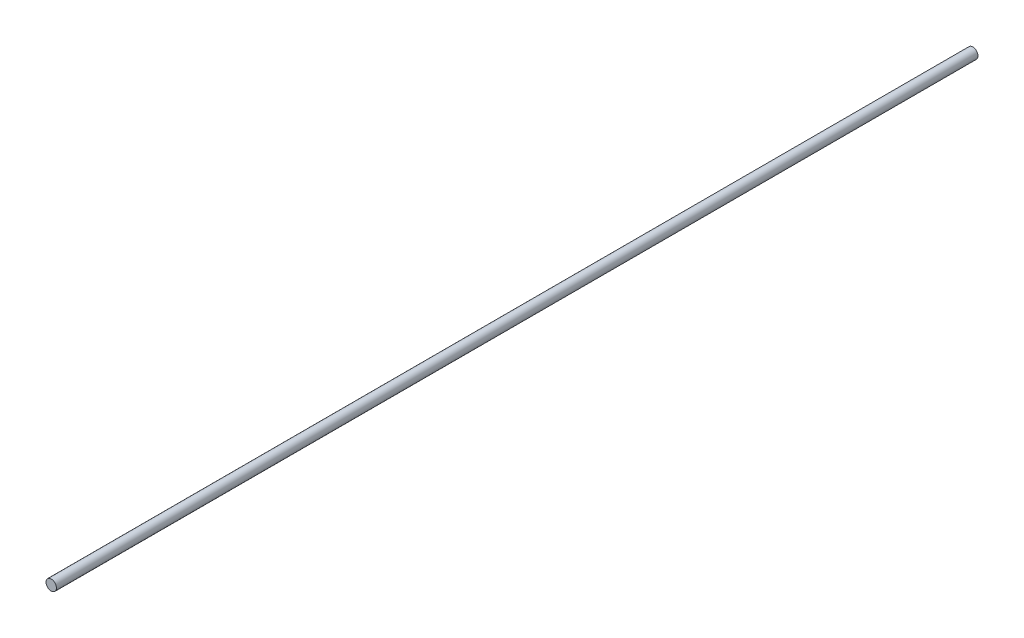
ISO-10303-21;
HEADER;
FILE_DESCRIPTION(('STEP AP214'),'2;1');
FILE_NAME('part.step','',(''),(''),'','','');
FILE_SCHEMA(('AUTOMOTIVE_DESIGN { 1 0 10303 214 1 1 1 1 }'));
ENDSEC;
DATA;
#1=APPLICATION_CONTEXT('core data for automotive mechanical design processes');
#2=APPLICATION_PROTOCOL_DEFINITION('international standard','automotive_design',2000,#1);
#3=PRODUCT_CONTEXT('',#1,'mechanical');
#4=PRODUCT('Part','Part','',(#3));
#5=PRODUCT_RELATED_PRODUCT_CATEGORY('part','',(#4));
#6=PRODUCT_DEFINITION_FORMATION('','',#4);
#7=PRODUCT_DEFINITION_CONTEXT('part definition',#1,'design');
#8=PRODUCT_DEFINITION('design','',#6,#7);
#9=PRODUCT_DEFINITION_SHAPE('','',#8);
#10=(LENGTH_UNIT() NAMED_UNIT(*) SI_UNIT(.MILLI.,.METRE.));
#11=(NAMED_UNIT(*) PLANE_ANGLE_UNIT() SI_UNIT($,.RADIAN.));
#12=(NAMED_UNIT(*) SI_UNIT($,.STERADIAN.) SOLID_ANGLE_UNIT());
#13=UNCERTAINTY_MEASURE_WITH_UNIT(LENGTH_MEASURE(1.E-05),#10,'distance_accuracy_value','');
#14=(GEOMETRIC_REPRESENTATION_CONTEXT(3) GLOBAL_UNCERTAINTY_ASSIGNED_CONTEXT((#13)) GLOBAL_UNIT_ASSIGNED_CONTEXT((#10,
#11,#12)) REPRESENTATION_CONTEXT('',''));
#15=CARTESIAN_POINT('',(0.,0.,0.));
#16=DIRECTION('',(0.,0.,1.));
#17=DIRECTION('',(1.,0.,0.));
#18=AXIS2_PLACEMENT_3D('',#15,#16,#17);
#19=CARTESIAN_POINT('',(0.,0.,706.));
#20=DIRECTION('',(0.,0.,-1.));
#21=DIRECTION('',(-1.,0.,0.));
#22=AXIS2_PLACEMENT_3D('',#19,#20,#21);
#23=CYLINDRICAL_SURFACE('',#22,4.);
#24=CARTESIAN_POINT('',(0.,0.,706.));
#25=DIRECTION('',(0.,0.,1.));
#26=DIRECTION('',(1.,0.,0.));
#27=AXIS2_PLACEMENT_3D('',#24,#25,#26);
#28=CIRCLE('',#27,4.);
#29=CARTESIAN_POINT('',(4.,0.,706.));
#30=VERTEX_POINT('',#29);
#31=EDGE_CURVE('E10',#30,#30,#28,.T.);
#32=ORIENTED_EDGE('',*,*,#31,.F.);
#33=EDGE_LOOP('',(#32));
#34=FACE_BOUND('',#33,.T.);
#35=CARTESIAN_POINT('',(0.,0.,0.));
#36=DIRECTION('',(0.,0.,1.));
#37=DIRECTION('',(1.,0.,0.));
#38=AXIS2_PLACEMENT_3D('',#35,#36,#37);
#39=CIRCLE('',#38,4.);
#40=CARTESIAN_POINT('',(4.,0.,0.));
#41=VERTEX_POINT('',#40);
#42=EDGE_CURVE('E36',#41,#41,#39,.T.);
#43=ORIENTED_EDGE('',*,*,#42,.T.);
#44=EDGE_LOOP('',(#43));
#45=FACE_BOUND('',#44,.T.);
#46=ADVANCED_FACE('F33',(#34,#45),#23,.T.);
#47=CARTESIAN_POINT('',(0.,0.,706.));
#48=DIRECTION('',(0.,0.,1.));
#49=DIRECTION('',(1.,0.,0.));
#50=AXIS2_PLACEMENT_3D('',#47,#48,#49);
#51=PLANE('',#50);
#52=ORIENTED_EDGE('',*,*,#31,.T.);
#53=EDGE_LOOP('',(#52));
#54=FACE_BOUND('',#53,.T.);
#55=ADVANCED_FACE('F48',(#54),#51,.T.);
#56=CARTESIAN_POINT('',(0.,0.,0.));
#57=DIRECTION('',(0.,0.,1.));
#58=DIRECTION('',(1.,0.,0.));
#59=AXIS2_PLACEMENT_3D('',#56,#57,#58);
#60=PLANE('',#59);
#61=ORIENTED_EDGE('',*,*,#42,.F.);
#62=EDGE_LOOP('',(#61));
#63=FACE_BOUND('',#62,.T.);
#64=ADVANCED_FACE('F46',(#63),#60,.F.);
#65=CLOSED_SHELL('',(#46,#55,#64));
#66=MANIFOLD_SOLID_BREP('B2',#65);
#67=ADVANCED_BREP_SHAPE_REPRESENTATION('',(#18,#66),#14);
#68=SHAPE_DEFINITION_REPRESENTATION(#9,#67);
ENDSEC;
END-ISO-10303-21;
